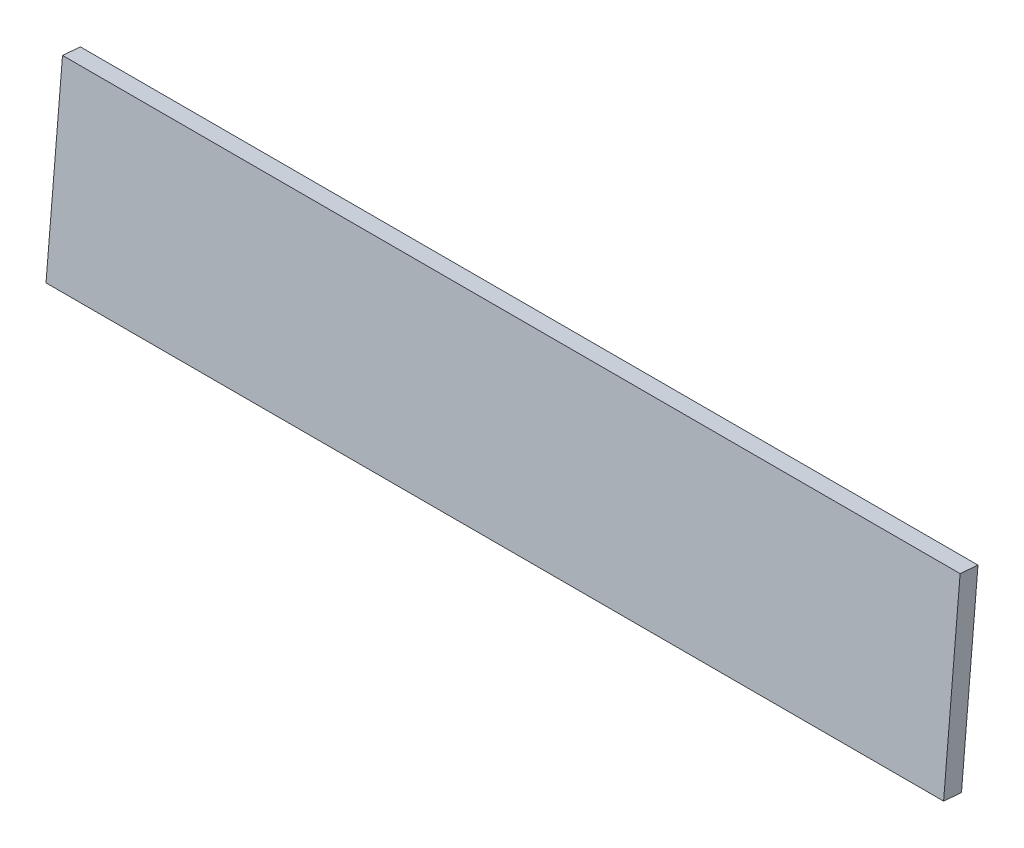
ISO-10303-21;
HEADER;
FILE_DESCRIPTION(('STEP AP214'),'2;1');
FILE_NAME('part.step','',(''),(''),'','','');
FILE_SCHEMA(('AUTOMOTIVE_DESIGN { 1 0 10303 214 1 1 1 1 }'));
ENDSEC;
DATA;
#1=APPLICATION_CONTEXT('core data for automotive mechanical design processes');
#2=APPLICATION_PROTOCOL_DEFINITION('international standard','automotive_design',2000,#1);
#3=PRODUCT_CONTEXT('',#1,'mechanical');
#4=PRODUCT('Part','Part','',(#3));
#5=PRODUCT_RELATED_PRODUCT_CATEGORY('part','',(#4));
#6=PRODUCT_DEFINITION_FORMATION('','',#4);
#7=PRODUCT_DEFINITION_CONTEXT('part definition',#1,'design');
#8=PRODUCT_DEFINITION('design','',#6,#7);
#9=PRODUCT_DEFINITION_SHAPE('','',#8);
#10=(LENGTH_UNIT() NAMED_UNIT(*) SI_UNIT(.MILLI.,.METRE.));
#11=(NAMED_UNIT(*) PLANE_ANGLE_UNIT() SI_UNIT($,.RADIAN.));
#12=(NAMED_UNIT(*) SI_UNIT($,.STERADIAN.) SOLID_ANGLE_UNIT());
#13=UNCERTAINTY_MEASURE_WITH_UNIT(LENGTH_MEASURE(1.E-05),#10,'distance_accuracy_value','');
#14=(GEOMETRIC_REPRESENTATION_CONTEXT(3) GLOBAL_UNCERTAINTY_ASSIGNED_CONTEXT((#13)) GLOBAL_UNIT_ASSIGNED_CONTEXT((#10,
#11,#12)) REPRESENTATION_CONTEXT('',''));
#15=CARTESIAN_POINT('',(0.,0.,0.));
#16=DIRECTION('',(0.,0.,1.));
#17=DIRECTION('',(1.,0.,0.));
#18=AXIS2_PLACEMENT_3D('',#15,#16,#17);
#19=CARTESIAN_POINT('',(-225.,95.4228980034448,0.685956721798164));
#20=DIRECTION('',(1.,0.,0.));
#21=DIRECTION('',(0.,0.,-1.));
#22=AXIS2_PLACEMENT_3D('',#19,#20,#21);
#23=PLANE('',#22);
#24=DIRECTION('',(0.,-0.996194698091745,0.0871557427476583));
#25=VECTOR('',#24,1.);
#26=CARTESIAN_POINT('',(-225.,94.6384963187159,-8.27979556102754));
#27=LINE('',#26,#25);
#28=CARTESIAN_POINT('',(-225.,94.6384963187159,-8.27979556102754));
#29=VERTEX_POINT('',#28);
#30=CARTESIAN_POINT('',(-225.,0.,0.));
#31=VERTEX_POINT('',#30);
#32=EDGE_CURVE('E111',#29,#31,#27,.T.);
#33=ORIENTED_EDGE('',*,*,#32,.T.);
#34=DIRECTION('',(0.,-0.0871557427476583,-0.996194698091746));
#35=VECTOR('',#34,1.);
#36=CARTESIAN_POINT('',(-225.,0.784401684728884,8.96575228282571));
#37=LINE('',#36,#35);
#38=CARTESIAN_POINT('',(-225.,0.784401684728884,8.96575228282571));
#39=VERTEX_POINT('',#38);
#40=EDGE_CURVE('E11',#39,#31,#37,.T.);
#41=ORIENTED_EDGE('',*,*,#40,.F.);
#42=DIRECTION('',(0.,-0.996194698091745,0.0871557427476583));
#43=VECTOR('',#42,1.);
#44=CARTESIAN_POINT('',(-225.,95.4228980034448,0.685956721798164));
#45=LINE('',#44,#43);
#46=CARTESIAN_POINT('',(-225.,95.4228980034448,0.685956721798164));
#47=VERTEX_POINT('',#46);
#48=EDGE_CURVE('E95',#47,#39,#45,.T.);
#49=ORIENTED_EDGE('',*,*,#48,.F.);
#50=DIRECTION('',(0.,-0.0871557427476583,-0.996194698091746));
#51=VECTOR('',#50,1.);
#52=CARTESIAN_POINT('',(-225.,95.4228980034448,0.685956721798164));
#53=LINE('',#52,#51);
#54=EDGE_CURVE('E107',#47,#29,#53,.T.);
#55=ORIENTED_EDGE('',*,*,#54,.T.);
#56=EDGE_LOOP('',(#33,#41,#49,#55));
#57=FACE_BOUND('',#56,.T.);
#58=ADVANCED_FACE('F43',(#57),#23,.F.);
#59=CARTESIAN_POINT('',(-225.,0.784401684728884,8.96575228282571));
#60=DIRECTION('',(0.,0.996194698091746,-0.0871557427476583));
#61=DIRECTION('',(0.,0.0871557427476583,0.996194698091746));
#62=AXIS2_PLACEMENT_3D('',#59,#60,#61);
#63=PLANE('',#62);
#64=DIRECTION('',(1.,0.,0.));
#65=VECTOR('',#64,1.);
#66=CARTESIAN_POINT('',(-225.,0.,0.));
#67=LINE('',#66,#65);
#68=CARTESIAN_POINT('',(225.,0.,0.));
#69=VERTEX_POINT('',#68);
#70=EDGE_CURVE('E100',#31,#69,#67,.T.);
#71=ORIENTED_EDGE('',*,*,#70,.T.);
#72=DIRECTION('',(0.,-0.0871557427476583,-0.996194698091746));
#73=VECTOR('',#72,1.);
#74=CARTESIAN_POINT('',(225.,0.784401684728884,8.96575228282571));
#75=LINE('',#74,#73);
#76=CARTESIAN_POINT('',(225.,0.784401684728884,8.96575228282571));
#77=VERTEX_POINT('',#76);
#78=EDGE_CURVE('E52',#77,#69,#75,.T.);
#79=ORIENTED_EDGE('',*,*,#78,.F.);
#80=DIRECTION('',(1.,0.,0.));
#81=VECTOR('',#80,1.);
#82=CARTESIAN_POINT('',(-225.,0.784401684728884,8.96575228282571));
#83=LINE('',#82,#81);
#84=EDGE_CURVE('E90',#39,#77,#83,.T.);
#85=ORIENTED_EDGE('',*,*,#84,.F.);
#86=ORIENTED_EDGE('',*,*,#40,.T.);
#87=EDGE_LOOP('',(#71,#79,#85,#86));
#88=FACE_BOUND('',#87,.T.);
#89=ADVANCED_FACE('F99',(#88),#63,.F.);
#90=CARTESIAN_POINT('',(225.,95.4228980034447,0.68595672179817));
#91=DIRECTION('',(-1.,0.,0.));
#92=DIRECTION('',(0.,0.,1.));
#93=AXIS2_PLACEMENT_3D('',#90,#91,#92);
#94=PLANE('',#93);
#95=DIRECTION('',(0.,0.996194698091746,-0.0871557427476584));
#96=VECTOR('',#95,1.);
#97=CARTESIAN_POINT('',(225.,94.6384963187158,-8.27979556102754));
#98=LINE('',#97,#96);
#99=CARTESIAN_POINT('',(225.,94.6384963187158,-8.27979556102754));
#100=VERTEX_POINT('',#99);
#101=EDGE_CURVE('E77',#69,#100,#98,.T.);
#102=ORIENTED_EDGE('',*,*,#101,.T.);
#103=DIRECTION('',(0.,-0.0871557427476583,-0.996194698091746));
#104=VECTOR('',#103,1.);
#105=CARTESIAN_POINT('',(225.,95.4228980034447,0.68595672179817));
#106=LINE('',#105,#104);
#107=CARTESIAN_POINT('',(225.,95.4228980034447,0.68595672179817));
#108=VERTEX_POINT('',#107);
#109=EDGE_CURVE('E102',#108,#100,#106,.T.);
#110=ORIENTED_EDGE('',*,*,#109,.F.);
#111=DIRECTION('',(0.,0.996194698091746,-0.0871557427476584));
#112=VECTOR('',#111,1.);
#113=CARTESIAN_POINT('',(225.,95.4228980034447,0.68595672179817));
#114=LINE('',#113,#112);
#115=EDGE_CURVE('E93',#77,#108,#114,.T.);
#116=ORIENTED_EDGE('',*,*,#115,.F.);
#117=ORIENTED_EDGE('',*,*,#78,.T.);
#118=EDGE_LOOP('',(#102,#110,#116,#117));
#119=FACE_BOUND('',#118,.T.);
#120=ADVANCED_FACE('F103',(#119),#94,.F.);
#121=CARTESIAN_POINT('',(-225.,95.4228980034448,0.685956721798164));
#122=DIRECTION('',(0.,-0.996194698091746,0.0871557427476583));
#123=DIRECTION('',(0.,-0.0871557427476583,-0.996194698091746));
#124=AXIS2_PLACEMENT_3D('',#121,#122,#123);
#125=PLANE('',#124);
#126=DIRECTION('',(-1.,0.,0.));
#127=VECTOR('',#126,1.);
#128=CARTESIAN_POINT('',(-225.,94.6384963187159,-8.27979556102754));
#129=LINE('',#128,#127);
#130=EDGE_CURVE('E83',#100,#29,#129,.T.);
#131=ORIENTED_EDGE('',*,*,#130,.T.);
#132=ORIENTED_EDGE('',*,*,#54,.F.);
#133=DIRECTION('',(-1.,0.,0.));
#134=VECTOR('',#133,1.);
#135=CARTESIAN_POINT('',(-225.,95.4228980034448,0.685956721798164));
#136=LINE('',#135,#134);
#137=EDGE_CURVE('E60',#108,#47,#136,.T.);
#138=ORIENTED_EDGE('',*,*,#137,.F.);
#139=ORIENTED_EDGE('',*,*,#109,.T.);
#140=EDGE_LOOP('',(#131,#132,#138,#139));
#141=FACE_BOUND('',#140,.T.);
#142=ADVANCED_FACE('F124',(#141),#125,.F.);
#143=CARTESIAN_POINT('',(0.,0.784401684728925,8.96575228282571));
#144=DIRECTION('',(0.,0.0871557427476583,0.996194698091746));
#145=DIRECTION('',(0.,-0.996194698091746,0.0871557427476583));
#146=AXIS2_PLACEMENT_3D('',#143,#144,#145);
#147=PLANE('',#146);
#148=ORIENTED_EDGE('',*,*,#48,.T.);
#149=ORIENTED_EDGE('',*,*,#84,.T.);
#150=ORIENTED_EDGE('',*,*,#115,.T.);
#151=ORIENTED_EDGE('',*,*,#137,.T.);
#152=EDGE_LOOP('',(#148,#149,#150,#151));
#153=FACE_BOUND('',#152,.T.);
#154=ADVANCED_FACE('F91',(#153),#147,.T.);
#155=CARTESIAN_POINT('',(0.,0.,0.));
#156=DIRECTION('',(0.,0.0871557427476583,0.996194698091746));
#157=DIRECTION('',(0.,-0.996194698091746,0.0871557427476583));
#158=AXIS2_PLACEMENT_3D('',#155,#156,#157);
#159=PLANE('',#158);
#160=ORIENTED_EDGE('',*,*,#32,.F.);
#161=ORIENTED_EDGE('',*,*,#130,.F.);
#162=ORIENTED_EDGE('',*,*,#101,.F.);
#163=ORIENTED_EDGE('',*,*,#70,.F.);
#164=EDGE_LOOP('',(#160,#161,#162,#163));
#165=FACE_BOUND('',#164,.T.);
#166=ADVANCED_FACE('F127',(#165),#159,.F.);
#167=CLOSED_SHELL('',(#58,#89,#120,#142,#154,#166));
#168=MANIFOLD_SOLID_BREP('B2',#167);
#169=ADVANCED_BREP_SHAPE_REPRESENTATION('',(#18,#168),#14);
#170=SHAPE_DEFINITION_REPRESENTATION(#9,#169);
ENDSEC;
END-ISO-10303-21;
